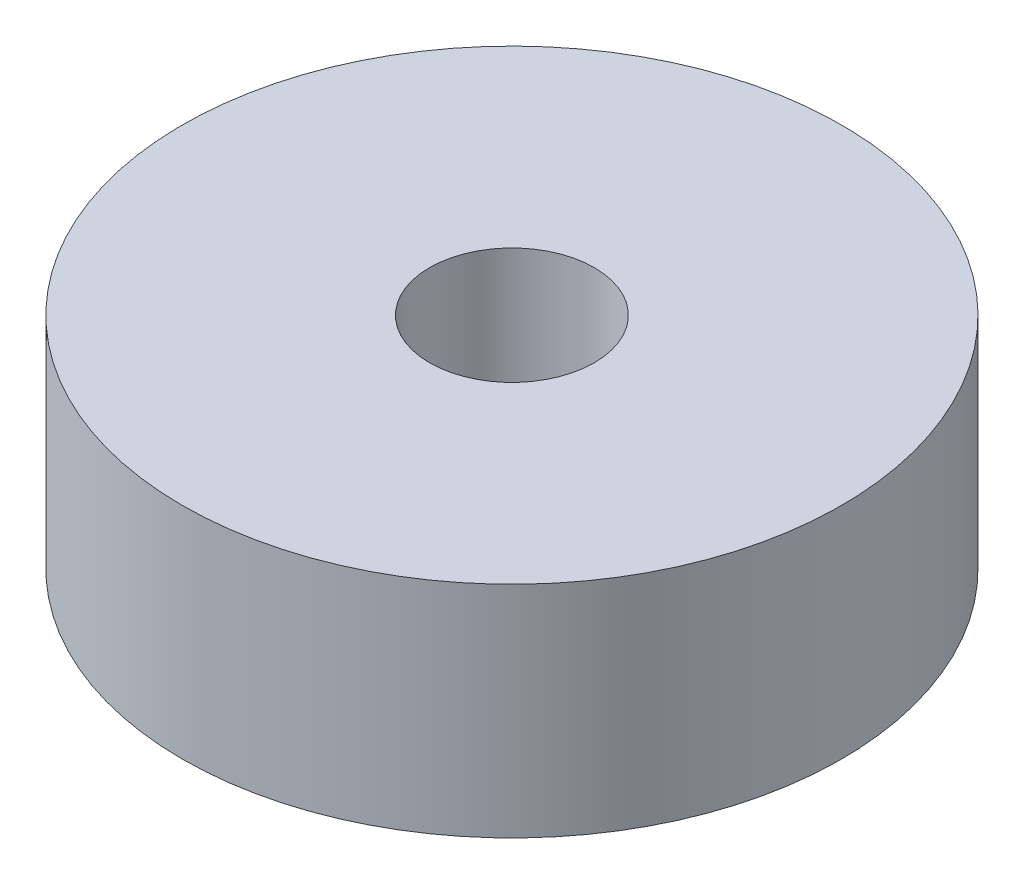
ISO-10303-21;
HEADER;
FILE_DESCRIPTION(('STEP AP214'),'2;1');
FILE_NAME('part.step','',(''),(''),'','','');
FILE_SCHEMA(('AUTOMOTIVE_DESIGN { 1 0 10303 214 1 1 1 1 }'));
ENDSEC;
DATA;
#1=APPLICATION_CONTEXT('core data for automotive mechanical design processes');
#2=APPLICATION_PROTOCOL_DEFINITION('international standard','automotive_design',2000,#1);
#3=PRODUCT_CONTEXT('',#1,'mechanical');
#4=PRODUCT('Part','Part','',(#3));
#5=PRODUCT_RELATED_PRODUCT_CATEGORY('part','',(#4));
#6=PRODUCT_DEFINITION_FORMATION('','',#4);
#7=PRODUCT_DEFINITION_CONTEXT('part definition',#1,'design');
#8=PRODUCT_DEFINITION('design','',#6,#7);
#9=PRODUCT_DEFINITION_SHAPE('','',#8);
#10=(LENGTH_UNIT() NAMED_UNIT(*) SI_UNIT(.MILLI.,.METRE.));
#11=(NAMED_UNIT(*) PLANE_ANGLE_UNIT() SI_UNIT($,.RADIAN.));
#12=(NAMED_UNIT(*) SI_UNIT($,.STERADIAN.) SOLID_ANGLE_UNIT());
#13=UNCERTAINTY_MEASURE_WITH_UNIT(LENGTH_MEASURE(1.E-05),#10,'distance_accuracy_value','');
#14=(GEOMETRIC_REPRESENTATION_CONTEXT(3) GLOBAL_UNCERTAINTY_ASSIGNED_CONTEXT((#13)) GLOBAL_UNIT_ASSIGNED_CONTEXT((#10,
#11,#12)) REPRESENTATION_CONTEXT('',''));
#15=CARTESIAN_POINT('',(0.,0.,0.));
#16=DIRECTION('',(0.,0.,1.));
#17=DIRECTION('',(1.,0.,0.));
#18=AXIS2_PLACEMENT_3D('',#15,#16,#17);
#19=CARTESIAN_POINT('',(0.,10.,0.));
#20=DIRECTION('',(0.,-1.,0.));
#21=DIRECTION('',(0.,0.,-1.));
#22=AXIS2_PLACEMENT_3D('',#19,#20,#21);
#23=CYLINDRICAL_SURFACE('',#22,15.);
#24=CARTESIAN_POINT('',(0.,10.,0.));
#25=DIRECTION('',(0.,1.,0.));
#26=DIRECTION('',(0.,0.,1.));
#27=AXIS2_PLACEMENT_3D('',#24,#25,#26);
#28=CIRCLE('',#27,15.);
#29=CARTESIAN_POINT('',(0.,10.,15.));
#30=VERTEX_POINT('',#29);
#31=EDGE_CURVE('E10',#30,#30,#28,.T.);
#32=ORIENTED_EDGE('',*,*,#31,.F.);
#33=EDGE_LOOP('',(#32));
#34=FACE_BOUND('',#33,.T.);
#35=CARTESIAN_POINT('',(0.,0.,0.));
#36=DIRECTION('',(0.,1.,0.));
#37=DIRECTION('',(0.,0.,1.));
#38=AXIS2_PLACEMENT_3D('',#35,#36,#37);
#39=CIRCLE('',#38,15.);
#40=CARTESIAN_POINT('',(0.,0.,15.));
#41=VERTEX_POINT('',#40);
#42=EDGE_CURVE('E37',#41,#41,#39,.T.);
#43=ORIENTED_EDGE('',*,*,#42,.T.);
#44=EDGE_LOOP('',(#43));
#45=FACE_BOUND('',#44,.T.);
#46=ADVANCED_FACE('F34',(#34,#45),#23,.T.);
#47=CARTESIAN_POINT('',(0.,10.,0.));
#48=DIRECTION('',(0.,1.,0.));
#49=DIRECTION('',(0.,0.,1.));
#50=AXIS2_PLACEMENT_3D('',#47,#48,#49);
#51=PLANE('',#50);
#52=CARTESIAN_POINT('',(0.,10.,0.));
#53=DIRECTION('',(0.,1.,0.));
#54=DIRECTION('',(0.,0.,1.));
#55=AXIS2_PLACEMENT_3D('',#52,#53,#54);
#56=CIRCLE('',#55,3.75);
#57=CARTESIAN_POINT('',(0.,10.,3.75));
#58=VERTEX_POINT('',#57);
#59=EDGE_CURVE('E48',#58,#58,#56,.T.);
#60=ORIENTED_EDGE('',*,*,#59,.F.);
#61=EDGE_LOOP('',(#60));
#62=FACE_BOUND('',#61,.T.);
#63=ORIENTED_EDGE('',*,*,#31,.T.);
#64=EDGE_LOOP('',(#63));
#65=FACE_BOUND('',#64,.T.);
#66=ADVANCED_FACE('F54',(#62,#65),#51,.T.);
#67=CARTESIAN_POINT('',(0.,0.,0.));
#68=DIRECTION('',(0.,1.,0.));
#69=DIRECTION('',(0.,0.,1.));
#70=AXIS2_PLACEMENT_3D('',#67,#68,#69);
#71=PLANE('',#70);
#72=CARTESIAN_POINT('',(0.,0.,0.));
#73=DIRECTION('',(0.,-1.,0.));
#74=DIRECTION('',(0.,0.,-1.));
#75=AXIS2_PLACEMENT_3D('',#72,#73,#74);
#76=CIRCLE('',#75,3.75);
#77=CARTESIAN_POINT('',(0.,0.,-3.75));
#78=VERTEX_POINT('',#77);
#79=EDGE_CURVE('E44',#78,#78,#76,.T.);
#80=ORIENTED_EDGE('',*,*,#79,.F.);
#81=EDGE_LOOP('',(#80));
#82=FACE_BOUND('',#81,.T.);
#83=ORIENTED_EDGE('',*,*,#42,.F.);
#84=EDGE_LOOP('',(#83));
#85=FACE_BOUND('',#84,.T.);
#86=ADVANCED_FACE('F56',(#82,#85),#71,.F.);
#87=CARTESIAN_POINT('',(0.,5.,0.));
#88=DIRECTION('',(0.,-1.,0.));
#89=DIRECTION('',(0.,0.,-1.));
#90=AXIS2_PLACEMENT_3D('',#87,#88,#89);
#91=CYLINDRICAL_SURFACE('',#90,3.75);
#92=ORIENTED_EDGE('',*,*,#79,.T.);
#93=EDGE_LOOP('',(#92));
#94=FACE_BOUND('',#93,.T.);
#95=ORIENTED_EDGE('',*,*,#59,.T.);
#96=EDGE_LOOP('',(#95));
#97=FACE_BOUND('',#96,.T.);
#98=ADVANCED_FACE('F52',(#94,#97),#91,.F.);
#99=CLOSED_SHELL('',(#46,#66,#86,#98));
#100=MANIFOLD_SOLID_BREP('B2',#99);
#101=ADVANCED_BREP_SHAPE_REPRESENTATION('',(#18,#100),#14);
#102=SHAPE_DEFINITION_REPRESENTATION(#9,#101);
ENDSEC;
END-ISO-10303-21;
